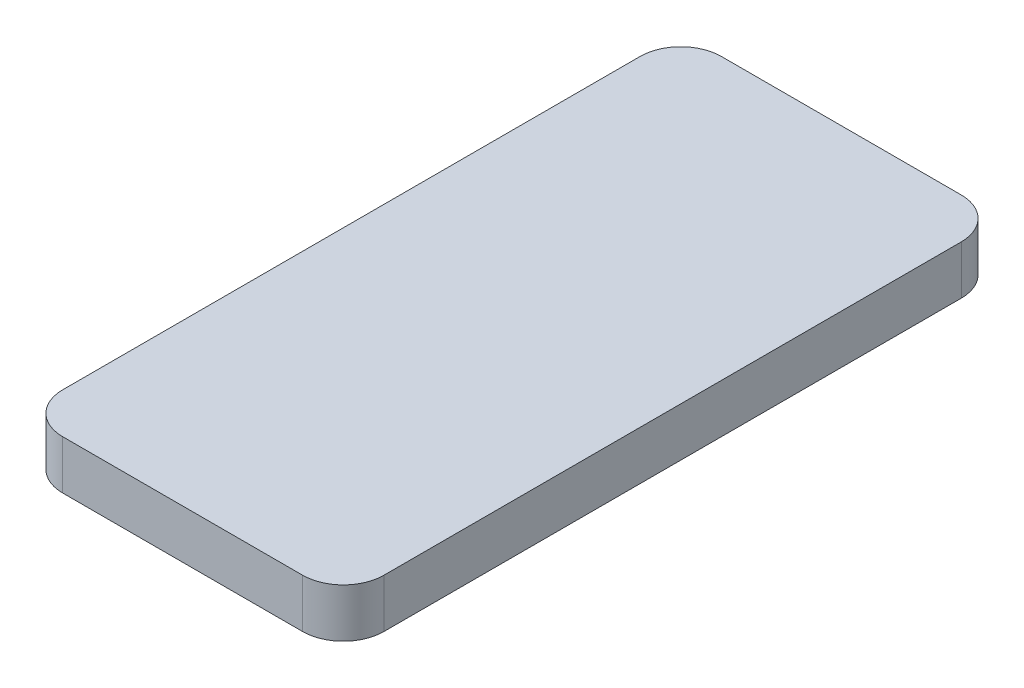
ISO-10303-21;
HEADER;
FILE_DESCRIPTION(('STEP AP214'),'2;1');
FILE_NAME('part.step','',(''),(''),'','','');
FILE_SCHEMA(('AUTOMOTIVE_DESIGN { 1 0 10303 214 1 1 1 1 }'));
ENDSEC;
DATA;
#1=APPLICATION_CONTEXT('core data for automotive mechanical design processes');
#2=APPLICATION_PROTOCOL_DEFINITION('international standard','automotive_design',2000,#1);
#3=PRODUCT_CONTEXT('',#1,'mechanical');
#4=PRODUCT('Part','Part','',(#3));
#5=PRODUCT_RELATED_PRODUCT_CATEGORY('part','',(#4));
#6=PRODUCT_DEFINITION_FORMATION('','',#4);
#7=PRODUCT_DEFINITION_CONTEXT('part definition',#1,'design');
#8=PRODUCT_DEFINITION('design','',#6,#7);
#9=PRODUCT_DEFINITION_SHAPE('','',#8);
#10=(LENGTH_UNIT() NAMED_UNIT(*) SI_UNIT(.MILLI.,.METRE.));
#11=(NAMED_UNIT(*) PLANE_ANGLE_UNIT() SI_UNIT($,.RADIAN.));
#12=(NAMED_UNIT(*) SI_UNIT($,.STERADIAN.) SOLID_ANGLE_UNIT());
#13=UNCERTAINTY_MEASURE_WITH_UNIT(LENGTH_MEASURE(1.E-05),#10,'distance_accuracy_value','');
#14=(GEOMETRIC_REPRESENTATION_CONTEXT(3) GLOBAL_UNCERTAINTY_ASSIGNED_CONTEXT((#13)) GLOBAL_UNIT_ASSIGNED_CONTEXT((#10,
#11,#12)) REPRESENTATION_CONTEXT('',''));
#15=CARTESIAN_POINT('',(0.,0.,0.));
#16=DIRECTION('',(0.,0.,1.));
#17=DIRECTION('',(1.,0.,0.));
#18=AXIS2_PLACEMENT_3D('',#15,#16,#17);
#19=CARTESIAN_POINT('',(39.5,12.,-81.));
#20=DIRECTION('',(-1.,0.,0.));
#21=DIRECTION('',(0.,0.,1.));
#22=AXIS2_PLACEMENT_3D('',#19,#20,#21);
#23=PLANE('',#22);
#24=DIRECTION('',(0.,0.,-1.));
#25=VECTOR('',#24,1.);
#26=CARTESIAN_POINT('',(39.5,0.,-81.));
#27=LINE('',#26,#25);
#28=CARTESIAN_POINT('',(39.5,0.,71.));
#29=VERTEX_POINT('',#28);
#30=CARTESIAN_POINT('',(39.5,0.,-71.));
#31=VERTEX_POINT('',#30);
#32=EDGE_CURVE('E129',#29,#31,#27,.T.);
#33=ORIENTED_EDGE('',*,*,#32,.T.);
#34=DIRECTION('',(0.,-1.,0.));
#35=VECTOR('',#34,1.);
#36=CARTESIAN_POINT('',(39.5,12.,-71.));
#37=LINE('',#36,#35);
#38=CARTESIAN_POINT('',(39.5,12.,-71.));
#39=VERTEX_POINT('',#38);
#40=EDGE_CURVE('E151',#31,#39,#37,.F.);
#41=ORIENTED_EDGE('',*,*,#40,.T.);
#42=DIRECTION('',(0.,0.,-1.));
#43=VECTOR('',#42,1.);
#44=CARTESIAN_POINT('',(39.5,12.,-81.));
#45=LINE('',#44,#43);
#46=CARTESIAN_POINT('',(39.5,12.,71.));
#47=VERTEX_POINT('',#46);
#48=EDGE_CURVE('E127',#47,#39,#45,.T.);
#49=ORIENTED_EDGE('',*,*,#48,.F.);
#50=DIRECTION('',(0.,-1.,0.));
#51=VECTOR('',#50,1.);
#52=CARTESIAN_POINT('',(39.5,12.,71.));
#53=LINE('',#52,#51);
#54=EDGE_CURVE('E148',#47,#29,#53,.T.);
#55=ORIENTED_EDGE('',*,*,#54,.T.);
#56=EDGE_LOOP('',(#33,#41,#49,#55));
#57=FACE_BOUND('',#56,.T.);
#58=ADVANCED_FACE('F32',(#57),#23,.F.);
#59=CARTESIAN_POINT('',(-39.5,12.,-81.));
#60=DIRECTION('',(0.,0.,1.));
#61=DIRECTION('',(1.,0.,0.));
#62=AXIS2_PLACEMENT_3D('',#59,#60,#61);
#63=PLANE('',#62);
#64=DIRECTION('',(-1.,0.,0.));
#65=VECTOR('',#64,1.);
#66=CARTESIAN_POINT('',(-39.5,0.,-81.));
#67=LINE('',#66,#65);
#68=CARTESIAN_POINT('',(29.5,0.,-81.));
#69=VERTEX_POINT('',#68);
#70=CARTESIAN_POINT('',(-29.5,0.,-81.));
#71=VERTEX_POINT('',#70);
#72=EDGE_CURVE('E125',#69,#71,#67,.T.);
#73=ORIENTED_EDGE('',*,*,#72,.T.);
#74=DIRECTION('',(0.,-1.,0.));
#75=VECTOR('',#74,1.);
#76=CARTESIAN_POINT('',(-29.5,12.,-81.));
#77=LINE('',#76,#75);
#78=CARTESIAN_POINT('',(-29.5,12.,-81.));
#79=VERTEX_POINT('',#78);
#80=EDGE_CURVE('E103',#71,#79,#77,.F.);
#81=ORIENTED_EDGE('',*,*,#80,.T.);
#82=DIRECTION('',(-1.,0.,0.));
#83=VECTOR('',#82,1.);
#84=CARTESIAN_POINT('',(-39.5,12.,-81.));
#85=LINE('',#84,#83);
#86=CARTESIAN_POINT('',(29.5,12.,-81.));
#87=VERTEX_POINT('',#86);
#88=EDGE_CURVE('E165',#87,#79,#85,.T.);
#89=ORIENTED_EDGE('',*,*,#88,.F.);
#90=DIRECTION('',(0.,-1.,0.));
#91=VECTOR('',#90,1.);
#92=CARTESIAN_POINT('',(29.5,12.,-81.));
#93=LINE('',#92,#91);
#94=EDGE_CURVE('E108',#87,#69,#93,.T.);
#95=ORIENTED_EDGE('',*,*,#94,.T.);
#96=EDGE_LOOP('',(#73,#81,#89,#95));
#97=FACE_BOUND('',#96,.T.);
#98=ADVANCED_FACE('F170',(#97),#63,.F.);
#99=CARTESIAN_POINT('',(-39.5,12.,-81.));
#100=DIRECTION('',(1.,0.,0.));
#101=DIRECTION('',(0.,0.,-1.));
#102=AXIS2_PLACEMENT_3D('',#99,#100,#101);
#103=PLANE('',#102);
#104=DIRECTION('',(0.,0.,1.));
#105=VECTOR('',#104,1.);
#106=CARTESIAN_POINT('',(-39.5,12.,-81.));
#107=LINE('',#106,#105);
#108=CARTESIAN_POINT('',(-39.5,12.,-71.));
#109=VERTEX_POINT('',#108);
#110=CARTESIAN_POINT('',(-39.5,12.,71.));
#111=VERTEX_POINT('',#110);
#112=EDGE_CURVE('E117',#109,#111,#107,.T.);
#113=ORIENTED_EDGE('',*,*,#112,.F.);
#114=DIRECTION('',(0.,-1.,0.));
#115=VECTOR('',#114,1.);
#116=CARTESIAN_POINT('',(-39.5,12.,-71.));
#117=LINE('',#116,#115);
#118=CARTESIAN_POINT('',(-39.5,0.,-71.));
#119=VERTEX_POINT('',#118);
#120=EDGE_CURVE('E102',#109,#119,#117,.T.);
#121=ORIENTED_EDGE('',*,*,#120,.T.);
#122=DIRECTION('',(0.,0.,1.));
#123=VECTOR('',#122,1.);
#124=CARTESIAN_POINT('',(-39.5,0.,-81.));
#125=LINE('',#124,#123);
#126=CARTESIAN_POINT('',(-39.5,0.,71.));
#127=VERTEX_POINT('',#126);
#128=EDGE_CURVE('E115',#119,#127,#125,.T.);
#129=ORIENTED_EDGE('',*,*,#128,.T.);
#130=DIRECTION('',(0.,-1.,0.));
#131=VECTOR('',#130,1.);
#132=CARTESIAN_POINT('',(-39.5,12.,71.));
#133=LINE('',#132,#131);
#134=EDGE_CURVE('E119',#127,#111,#133,.F.);
#135=ORIENTED_EDGE('',*,*,#134,.T.);
#136=EDGE_LOOP('',(#113,#121,#129,#135));
#137=FACE_BOUND('',#136,.T.);
#138=ADVANCED_FACE('F114',(#137),#103,.F.);
#139=CARTESIAN_POINT('',(-39.5,12.,81.));
#140=DIRECTION('',(0.,0.,-1.));
#141=DIRECTION('',(-1.,0.,0.));
#142=AXIS2_PLACEMENT_3D('',#139,#140,#141);
#143=PLANE('',#142);
#144=DIRECTION('',(1.,0.,0.));
#145=VECTOR('',#144,1.);
#146=CARTESIAN_POINT('',(-39.5,12.,81.));
#147=LINE('',#146,#145);
#148=CARTESIAN_POINT('',(-29.5,12.,81.));
#149=VERTEX_POINT('',#148);
#150=CARTESIAN_POINT('',(29.5,12.,81.));
#151=VERTEX_POINT('',#150);
#152=EDGE_CURVE('E133',#149,#151,#147,.T.);
#153=ORIENTED_EDGE('',*,*,#152,.F.);
#154=DIRECTION('',(0.,-1.,0.));
#155=VECTOR('',#154,1.);
#156=CARTESIAN_POINT('',(-29.5,12.,81.));
#157=LINE('',#156,#155);
#158=CARTESIAN_POINT('',(-29.5,0.,81.));
#159=VERTEX_POINT('',#158);
#160=EDGE_CURVE('E11',#149,#159,#157,.T.);
#161=ORIENTED_EDGE('',*,*,#160,.T.);
#162=DIRECTION('',(1.,0.,0.));
#163=VECTOR('',#162,1.);
#164=CARTESIAN_POINT('',(-39.5,0.,81.));
#165=LINE('',#164,#163);
#166=CARTESIAN_POINT('',(29.5,0.,81.));
#167=VERTEX_POINT('',#166);
#168=EDGE_CURVE('E124',#159,#167,#165,.T.);
#169=ORIENTED_EDGE('',*,*,#168,.T.);
#170=DIRECTION('',(0.,-1.,0.));
#171=VECTOR('',#170,1.);
#172=CARTESIAN_POINT('',(29.5,12.,81.));
#173=LINE('',#172,#171);
#174=EDGE_CURVE('E40',#167,#151,#173,.F.);
#175=ORIENTED_EDGE('',*,*,#174,.T.);
#176=EDGE_LOOP('',(#153,#161,#169,#175));
#177=FACE_BOUND('',#176,.T.);
#178=ADVANCED_FACE('F177',(#177),#143,.F.);
#179=CARTESIAN_POINT('',(0.,12.,0.));
#180=DIRECTION('',(0.,1.,0.));
#181=DIRECTION('',(0.,0.,1.));
#182=AXIS2_PLACEMENT_3D('',#179,#180,#181);
#183=PLANE('',#182);
#184=ORIENTED_EDGE('',*,*,#88,.T.);
#185=CARTESIAN_POINT('',(-29.5,12.,-71.));
#186=DIRECTION('',(0.,1.,0.));
#187=DIRECTION('',(0.,0.,1.));
#188=AXIS2_PLACEMENT_3D('',#185,#186,#187);
#189=CIRCLE('',#188,10.);
#190=EDGE_CURVE('E146',#79,#109,#189,.T.);
#191=ORIENTED_EDGE('',*,*,#190,.T.);
#192=ORIENTED_EDGE('',*,*,#112,.T.);
#193=CARTESIAN_POINT('',(-29.5,12.,71.));
#194=DIRECTION('',(0.,1.,0.));
#195=DIRECTION('',(0.,0.,1.));
#196=AXIS2_PLACEMENT_3D('',#193,#194,#195);
#197=CIRCLE('',#196,10.);
#198=EDGE_CURVE('E53',#111,#149,#197,.T.);
#199=ORIENTED_EDGE('',*,*,#198,.T.);
#200=ORIENTED_EDGE('',*,*,#152,.T.);
#201=CARTESIAN_POINT('',(29.5,12.,71.));
#202=DIRECTION('',(0.,1.,0.));
#203=DIRECTION('',(0.,0.,1.));
#204=AXIS2_PLACEMENT_3D('',#201,#202,#203);
#205=CIRCLE('',#204,10.);
#206=EDGE_CURVE('E141',#151,#47,#205,.T.);
#207=ORIENTED_EDGE('',*,*,#206,.T.);
#208=ORIENTED_EDGE('',*,*,#48,.T.);
#209=CARTESIAN_POINT('',(29.5,12.,-71.));
#210=DIRECTION('',(0.,1.,0.));
#211=DIRECTION('',(0.,0.,1.));
#212=AXIS2_PLACEMENT_3D('',#209,#210,#211);
#213=CIRCLE('',#212,10.);
#214=EDGE_CURVE('E144',#39,#87,#213,.T.);
#215=ORIENTED_EDGE('',*,*,#214,.T.);
#216=EDGE_LOOP('',(#184,#191,#192,#199,#200,#207,#208,#215));
#217=FACE_BOUND('',#216,.T.);
#218=ADVANCED_FACE('F162',(#217),#183,.T.);
#219=CARTESIAN_POINT('',(0.,0.,0.));
#220=DIRECTION('',(0.,1.,0.));
#221=DIRECTION('',(0.,0.,1.));
#222=AXIS2_PLACEMENT_3D('',#219,#220,#221);
#223=PLANE('',#222);
#224=ORIENTED_EDGE('',*,*,#128,.F.);
#225=CARTESIAN_POINT('',(-29.5,0.,-71.));
#226=DIRECTION('',(0.,1.,0.));
#227=DIRECTION('',(0.,0.,1.));
#228=AXIS2_PLACEMENT_3D('',#225,#226,#227);
#229=CIRCLE('',#228,10.);
#230=EDGE_CURVE('E98',#119,#71,#229,.F.);
#231=ORIENTED_EDGE('',*,*,#230,.T.);
#232=ORIENTED_EDGE('',*,*,#72,.F.);
#233=CARTESIAN_POINT('',(29.5,0.,-71.));
#234=DIRECTION('',(0.,1.,0.));
#235=DIRECTION('',(0.,0.,1.));
#236=AXIS2_PLACEMENT_3D('',#233,#234,#235);
#237=CIRCLE('',#236,10.);
#238=EDGE_CURVE('E109',#69,#31,#237,.F.);
#239=ORIENTED_EDGE('',*,*,#238,.T.);
#240=ORIENTED_EDGE('',*,*,#32,.F.);
#241=CARTESIAN_POINT('',(29.5,0.,71.));
#242=DIRECTION('',(0.,1.,0.));
#243=DIRECTION('',(0.,0.,1.));
#244=AXIS2_PLACEMENT_3D('',#241,#242,#243);
#245=CIRCLE('',#244,10.);
#246=EDGE_CURVE('E118',#29,#167,#245,.F.);
#247=ORIENTED_EDGE('',*,*,#246,.T.);
#248=ORIENTED_EDGE('',*,*,#168,.F.);
#249=CARTESIAN_POINT('',(-29.5,0.,71.));
#250=DIRECTION('',(0.,1.,0.));
#251=DIRECTION('',(0.,0.,1.));
#252=AXIS2_PLACEMENT_3D('',#249,#250,#251);
#253=CIRCLE('',#252,10.);
#254=EDGE_CURVE('E123',#159,#127,#253,.F.);
#255=ORIENTED_EDGE('',*,*,#254,.T.);
#256=EDGE_LOOP('',(#224,#231,#232,#239,#240,#247,#248,#255));
#257=FACE_BOUND('',#256,.T.);
#258=ADVANCED_FACE('F121',(#257),#223,.F.);
#259=CARTESIAN_POINT('',(-29.5,12.,-71.));
#260=DIRECTION('',(0.,-1.,0.));
#261=DIRECTION('',(0.,0.,-1.));
#262=AXIS2_PLACEMENT_3D('',#259,#260,#261);
#263=CYLINDRICAL_SURFACE('',#262,10.);
#264=ORIENTED_EDGE('',*,*,#190,.F.);
#265=ORIENTED_EDGE('',*,*,#80,.F.);
#266=ORIENTED_EDGE('',*,*,#230,.F.);
#267=ORIENTED_EDGE('',*,*,#120,.F.);
#268=EDGE_LOOP('',(#264,#265,#266,#267));
#269=FACE_BOUND('',#268,.T.);
#270=ADVANCED_FACE('F101',(#269),#263,.T.);
#271=CARTESIAN_POINT('',(29.5,12.,-71.));
#272=DIRECTION('',(0.,-1.,0.));
#273=DIRECTION('',(0.,0.,-1.));
#274=AXIS2_PLACEMENT_3D('',#271,#272,#273);
#275=CYLINDRICAL_SURFACE('',#274,10.);
#276=ORIENTED_EDGE('',*,*,#214,.F.);
#277=ORIENTED_EDGE('',*,*,#40,.F.);
#278=ORIENTED_EDGE('',*,*,#238,.F.);
#279=ORIENTED_EDGE('',*,*,#94,.F.);
#280=EDGE_LOOP('',(#276,#277,#278,#279));
#281=FACE_BOUND('',#280,.T.);
#282=ADVANCED_FACE('F168',(#281),#275,.T.);
#283=CARTESIAN_POINT('',(-29.5,12.,71.));
#284=DIRECTION('',(0.,-1.,0.));
#285=DIRECTION('',(0.,0.,-1.));
#286=AXIS2_PLACEMENT_3D('',#283,#284,#285);
#287=CYLINDRICAL_SURFACE('',#286,10.);
#288=ORIENTED_EDGE('',*,*,#198,.F.);
#289=ORIENTED_EDGE('',*,*,#134,.F.);
#290=ORIENTED_EDGE('',*,*,#254,.F.);
#291=ORIENTED_EDGE('',*,*,#160,.F.);
#292=EDGE_LOOP('',(#288,#289,#290,#291));
#293=FACE_BOUND('',#292,.T.);
#294=ADVANCED_FACE('F176',(#293),#287,.T.);
#295=CARTESIAN_POINT('',(29.5,12.,71.));
#296=DIRECTION('',(0.,-1.,0.));
#297=DIRECTION('',(0.,0.,-1.));
#298=AXIS2_PLACEMENT_3D('',#295,#296,#297);
#299=CYLINDRICAL_SURFACE('',#298,10.);
#300=ORIENTED_EDGE('',*,*,#206,.F.);
#301=ORIENTED_EDGE('',*,*,#174,.F.);
#302=ORIENTED_EDGE('',*,*,#246,.F.);
#303=ORIENTED_EDGE('',*,*,#54,.F.);
#304=EDGE_LOOP('',(#300,#301,#302,#303));
#305=FACE_BOUND('',#304,.T.);
#306=ADVANCED_FACE('F34',(#305),#299,.T.);
#307=CLOSED_SHELL('',(#58,#98,#138,#178,#218,#258,#270,#282,#294,#306));
#308=MANIFOLD_SOLID_BREP('B2',#307);
#309=ADVANCED_BREP_SHAPE_REPRESENTATION('',(#18,#308),#14);
#310=SHAPE_DEFINITION_REPRESENTATION(#9,#309);
ENDSEC;
END-ISO-10303-21;
